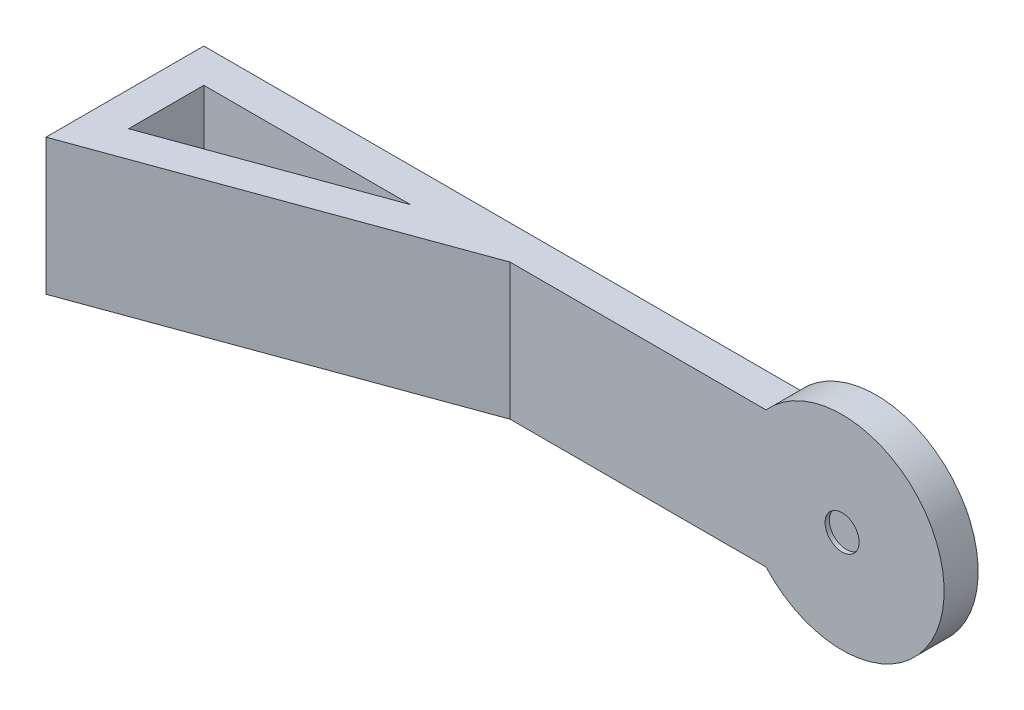
ISO-10303-21;
HEADER;
FILE_DESCRIPTION(('STEP AP214'),'2;1');
FILE_NAME('part.step','',(''),(''),'','','');
FILE_SCHEMA(('AUTOMOTIVE_DESIGN { 1 0 10303 214 1 1 1 1 }'));
ENDSEC;
DATA;
#1=APPLICATION_CONTEXT('core data for automotive mechanical design processes');
#2=APPLICATION_PROTOCOL_DEFINITION('international standard','automotive_design',2000,#1);
#3=PRODUCT_CONTEXT('',#1,'mechanical');
#4=PRODUCT('Part','Part','',(#3));
#5=PRODUCT_RELATED_PRODUCT_CATEGORY('part','',(#4));
#6=PRODUCT_DEFINITION_FORMATION('','',#4);
#7=PRODUCT_DEFINITION_CONTEXT('part definition',#1,'design');
#8=PRODUCT_DEFINITION('design','',#6,#7);
#9=PRODUCT_DEFINITION_SHAPE('','',#8);
#10=(LENGTH_UNIT() NAMED_UNIT(*) SI_UNIT(.MILLI.,.METRE.));
#11=(NAMED_UNIT(*) PLANE_ANGLE_UNIT() SI_UNIT($,.RADIAN.));
#12=(NAMED_UNIT(*) SI_UNIT($,.STERADIAN.) SOLID_ANGLE_UNIT());
#13=UNCERTAINTY_MEASURE_WITH_UNIT(LENGTH_MEASURE(1.E-05),#10,'distance_accuracy_value','');
#14=(GEOMETRIC_REPRESENTATION_CONTEXT(3) GLOBAL_UNCERTAINTY_ASSIGNED_CONTEXT((#13)) GLOBAL_UNIT_ASSIGNED_CONTEXT((#10,
#11,#12)) REPRESENTATION_CONTEXT('',''));
#15=CARTESIAN_POINT('',(0.,0.,0.));
#16=DIRECTION('',(0.,0.,1.));
#17=DIRECTION('',(1.,0.,0.));
#18=AXIS2_PLACEMENT_3D('',#15,#16,#17);
#19=CARTESIAN_POINT('',(125.500968342876,-12.6999999999999,-19.05));
#20=DIRECTION('',(0.,0.,1.));
#21=DIRECTION('',(-1.,0.,0.));
#22=AXIS2_PLACEMENT_3D('',#19,#20,#21);
#23=CYLINDRICAL_SURFACE('',#22,3.175);
#24=CARTESIAN_POINT('',(125.500968342876,-12.7,0.));
#25=DIRECTION('',(0.,0.,1.));
#26=DIRECTION('',(-1.,0.,0.));
#27=AXIS2_PLACEMENT_3D('',#24,#25,#26);
#28=CIRCLE('',#27,3.175);
#29=CARTESIAN_POINT('',(122.325968342876,-12.7,0.));
#30=VERTEX_POINT('',#29);
#31=EDGE_CURVE('E189',#30,#30,#28,.T.);
#32=ORIENTED_EDGE('',*,*,#31,.F.);
#33=EDGE_LOOP('',(#32));
#34=FACE_BOUND('',#33,.T.);
#35=CARTESIAN_POINT('',(125.500968342876,-12.7,0.793749999999955));
#36=DIRECTION('',(0.,0.,1.));
#37=DIRECTION('',(-1.,0.,0.));
#38=AXIS2_PLACEMENT_3D('',#35,#36,#37);
#39=CIRCLE('',#38,3.175);
#40=CARTESIAN_POINT('',(122.325968342876,-12.7,0.793749999999955));
#41=VERTEX_POINT('',#40);
#42=EDGE_CURVE('E12',#41,#41,#39,.F.);
#43=ORIENTED_EDGE('',*,*,#42,.F.);
#44=EDGE_LOOP('',(#43));
#45=FACE_BOUND('',#44,.T.);
#46=ADVANCED_FACE('F43',(#34,#45),#23,.F.);
#47=CARTESIAN_POINT('',(0.,-25.4,0.));
#48=DIRECTION('',(0.,1.,0.));
#49=DIRECTION('',(-1.,0.,0.));
#50=AXIS2_PLACEMENT_3D('',#47,#48,#49);
#51=PLANE('',#50);
#52=DIRECTION('',(1.,0.,0.));
#53=VECTOR('',#52,1.);
#54=CARTESIAN_POINT('',(139.7,-25.4,0.));
#55=LINE('',#54,#53);
#56=CARTESIAN_POINT('',(0.,-25.4,0.));
#57=VERTEX_POINT('',#56);
#58=CARTESIAN_POINT('',(111.301936685753,-25.4,0.));
#59=VERTEX_POINT('',#58);
#60=EDGE_CURVE('E58',#57,#59,#55,.T.);
#61=ORIENTED_EDGE('',*,*,#60,.T.);
#62=DIRECTION('',(0.,0.,1.));
#63=VECTOR('',#62,1.);
#64=CARTESIAN_POINT('',(111.301936685753,-25.3999999999998,-53.881536726415));
#65=LINE('',#64,#63);
#66=CARTESIAN_POINT('',(111.301936685753,-25.4,6.34999999999991));
#67=VERTEX_POINT('',#66);
#68=EDGE_CURVE('E139',#59,#67,#65,.T.);
#69=ORIENTED_EDGE('',*,*,#68,.T.);
#70=DIRECTION('',(-1.,0.,0.));
#71=VECTOR('',#70,1.);
#72=CARTESIAN_POINT('',(63.5,-25.4,6.34999999999991));
#73=LINE('',#72,#71);
#74=CARTESIAN_POINT('',(63.5,-25.4,6.34999999999991));
#75=VERTEX_POINT('',#74);
#76=EDGE_CURVE('E146',#67,#75,#73,.T.);
#77=ORIENTED_EDGE('',*,*,#76,.T.);
#78=DIRECTION('',(-0.939692620785908,0.,0.34202014332567));
#79=VECTOR('',#78,1.);
#80=CARTESIAN_POINT('',(0.,-25.4000000000001,29.4621098759038));
#81=LINE('',#80,#79);
#82=CARTESIAN_POINT('',(0.,-25.4000000000001,29.4621098759038));
#83=VERTEX_POINT('',#82);
#84=EDGE_CURVE('E149',#75,#83,#81,.T.);
#85=ORIENTED_EDGE('',*,*,#84,.T.);
#86=DIRECTION('',(0.,0.,-1.));
#87=VECTOR('',#86,1.);
#88=CARTESIAN_POINT('',(0.,-25.4,0.));
#89=LINE('',#88,#87);
#90=EDGE_CURVE('E151',#83,#57,#89,.T.);
#91=ORIENTED_EDGE('',*,*,#90,.T.);
#92=EDGE_LOOP('',(#61,#69,#77,#85,#91));
#93=FACE_BOUND('',#92,.T.);
#94=DIRECTION('',(-0.939692620785908,0.,0.34202014332567));
#95=VECTOR('',#94,1.);
#96=CARTESIAN_POINT('',(6.35,-25.4000000000001,20.3933700330914));
#97=LINE('',#96,#95);
#98=CARTESIAN_POINT('',(44.9338420589645,-25.4,6.34999999999991));
#99=VERTEX_POINT('',#98);
#100=CARTESIAN_POINT('',(6.35,-25.4000000000001,20.3933700330914));
#101=VERTEX_POINT('',#100);
#102=EDGE_CURVE('E110',#99,#101,#97,.T.);
#103=ORIENTED_EDGE('',*,*,#102,.F.);
#104=DIRECTION('',(1.,0.,0.));
#105=VECTOR('',#104,1.);
#106=CARTESIAN_POINT('',(44.9338420589645,-25.4,6.34999999999991));
#107=LINE('',#106,#105);
#108=CARTESIAN_POINT('',(6.35,-25.4,6.34999999999991));
#109=VERTEX_POINT('',#108);
#110=EDGE_CURVE('E132',#109,#99,#107,.T.);
#111=ORIENTED_EDGE('',*,*,#110,.F.);
#112=DIRECTION('',(0.,0.,-1.));
#113=VECTOR('',#112,1.);
#114=CARTESIAN_POINT('',(6.35,-25.4,6.34999999999991));
#115=LINE('',#114,#113);
#116=EDGE_CURVE('E120',#101,#109,#115,.T.);
#117=ORIENTED_EDGE('',*,*,#116,.F.);
#118=EDGE_LOOP('',(#103,#111,#117));
#119=FACE_BOUND('',#118,.T.);
#120=ADVANCED_FACE('F131',(#93,#119),#51,.F.);
#121=CARTESIAN_POINT('',(0.,0.,0.));
#122=DIRECTION('',(0.,1.,0.));
#123=DIRECTION('',(-1.,0.,0.));
#124=AXIS2_PLACEMENT_3D('',#121,#122,#123);
#125=PLANE('',#124);
#126=DIRECTION('',(0.,0.,1.));
#127=VECTOR('',#126,1.);
#128=CARTESIAN_POINT('',(111.301936685753,1.88126379988469E-13,-53.881536726415));
#129=LINE('',#128,#127);
#130=CARTESIAN_POINT('',(111.301936685753,0.,0.));
#131=VERTEX_POINT('',#130);
#132=CARTESIAN_POINT('',(111.301936685753,0.,6.35));
#133=VERTEX_POINT('',#132);
#134=EDGE_CURVE('E185',#131,#133,#129,.T.);
#135=ORIENTED_EDGE('',*,*,#134,.F.);
#136=DIRECTION('',(1.,0.,0.));
#137=VECTOR('',#136,1.);
#138=CARTESIAN_POINT('',(139.7,0.,0.));
#139=LINE('',#138,#137);
#140=CARTESIAN_POINT('',(0.,0.,0.));
#141=VERTEX_POINT('',#140);
#142=EDGE_CURVE('E128',#141,#131,#139,.T.);
#143=ORIENTED_EDGE('',*,*,#142,.F.);
#144=DIRECTION('',(0.,0.,-1.));
#145=VECTOR('',#144,1.);
#146=CARTESIAN_POINT('',(0.,0.,0.));
#147=LINE('',#146,#145);
#148=CARTESIAN_POINT('',(0.,-1.02866406834665E-13,29.4621098759039));
#149=VERTEX_POINT('',#148);
#150=EDGE_CURVE('E147',#149,#141,#147,.T.);
#151=ORIENTED_EDGE('',*,*,#150,.F.);
#152=DIRECTION('',(-0.939692620785908,0.,0.34202014332567));
#153=VECTOR('',#152,1.);
#154=CARTESIAN_POINT('',(0.,-1.02866406834665E-13,29.4621098759039));
#155=LINE('',#154,#153);
#156=CARTESIAN_POINT('',(63.5,0.,6.35));
#157=VERTEX_POINT('',#156);
#158=EDGE_CURVE('E158',#157,#149,#155,.T.);
#159=ORIENTED_EDGE('',*,*,#158,.F.);
#160=DIRECTION('',(-1.,0.,0.));
#161=VECTOR('',#160,1.);
#162=CARTESIAN_POINT('',(63.5,0.,6.35));
#163=LINE('',#162,#161);
#164=EDGE_CURVE('E156',#133,#157,#163,.T.);
#165=ORIENTED_EDGE('',*,*,#164,.F.);
#166=EDGE_LOOP('',(#135,#143,#151,#159,#165));
#167=FACE_BOUND('',#166,.T.);
#168=DIRECTION('',(1.,0.,0.));
#169=VECTOR('',#168,1.);
#170=CARTESIAN_POINT('',(44.9338420589645,0.,6.35));
#171=LINE('',#170,#169);
#172=CARTESIAN_POINT('',(6.35,0.,6.34999999999999));
#173=VERTEX_POINT('',#172);
#174=CARTESIAN_POINT('',(44.9338420589645,0.,6.35));
#175=VERTEX_POINT('',#174);
#176=EDGE_CURVE('E121',#173,#175,#171,.T.);
#177=ORIENTED_EDGE('',*,*,#176,.T.);
#178=DIRECTION('',(-0.939692620785908,0.,0.34202014332567));
#179=VECTOR('',#178,1.);
#180=CARTESIAN_POINT('',(6.35,0.,20.3933700330915));
#181=LINE('',#180,#179);
#182=CARTESIAN_POINT('',(6.35,0.,20.3933700330915));
#183=VERTEX_POINT('',#182);
#184=EDGE_CURVE('E137',#175,#183,#181,.T.);
#185=ORIENTED_EDGE('',*,*,#184,.T.);
#186=DIRECTION('',(0.,0.,-1.));
#187=VECTOR('',#186,1.);
#188=CARTESIAN_POINT('',(6.35,0.,6.34999999999999));
#189=LINE('',#188,#187);
#190=EDGE_CURVE('E127',#183,#173,#189,.T.);
#191=ORIENTED_EDGE('',*,*,#190,.T.);
#192=EDGE_LOOP('',(#177,#185,#191));
#193=FACE_BOUND('',#192,.T.);
#194=ADVANCED_FACE('F177',(#167,#193),#125,.T.);
#195=CARTESIAN_POINT('',(139.7,-25.4,0.));
#196=DIRECTION('',(0.,0.,1.));
#197=DIRECTION('',(-1.,0.,0.));
#198=AXIS2_PLACEMENT_3D('',#195,#196,#197);
#199=PLANE('',#198);
#200=ORIENTED_EDGE('',*,*,#31,.T.);
#201=EDGE_LOOP('',(#200));
#202=FACE_BOUND('',#201,.T.);
#203=ORIENTED_EDGE('',*,*,#142,.T.);
#204=CARTESIAN_POINT('',(125.500968342876,-12.7,0.));
#205=DIRECTION('',(0.,0.,1.));
#206=DIRECTION('',(-1.,0.,0.));
#207=AXIS2_PLACEMENT_3D('',#204,#205,#206);
#208=CIRCLE('',#207,19.05);
#209=EDGE_CURVE('E65',#131,#59,#208,.F.);
#210=ORIENTED_EDGE('',*,*,#209,.T.);
#211=ORIENTED_EDGE('',*,*,#60,.F.);
#212=DIRECTION('',(0.,1.,0.));
#213=VECTOR('',#212,1.);
#214=CARTESIAN_POINT('',(0.,-25.4,0.));
#215=LINE('',#214,#213);
#216=EDGE_CURVE('E153',#57,#141,#215,.T.);
#217=ORIENTED_EDGE('',*,*,#216,.T.);
#218=EDGE_LOOP('',(#203,#210,#211,#217));
#219=FACE_BOUND('',#218,.T.);
#220=ADVANCED_FACE('F45',(#202,#219),#199,.F.);
#221=CARTESIAN_POINT('',(63.5,-25.4,6.34999999999991));
#222=DIRECTION('',(0.,0.,-1.));
#223=DIRECTION('',(1.,0.,0.));
#224=AXIS2_PLACEMENT_3D('',#221,#222,#223);
#225=PLANE('',#224);
#226=CARTESIAN_POINT('',(125.500968342876,-12.7,6.34999999999996));
#227=DIRECTION('',(0.,0.,1.));
#228=DIRECTION('',(-1.,0.,0.));
#229=AXIS2_PLACEMENT_3D('',#226,#227,#228);
#230=CIRCLE('',#229,3.175);
#231=CARTESIAN_POINT('',(122.325968342876,-12.7,6.34999999999996));
#232=VERTEX_POINT('',#231);
#233=EDGE_CURVE('E327',#232,#232,#230,.T.);
#234=ORIENTED_EDGE('',*,*,#233,.F.);
#235=EDGE_LOOP('',(#234));
#236=FACE_BOUND('',#235,.T.);
#237=ORIENTED_EDGE('',*,*,#76,.F.);
#238=CARTESIAN_POINT('',(125.500968342876,-12.7,6.34999999999996));
#239=DIRECTION('',(0.,0.,1.));
#240=DIRECTION('',(-1.,0.,0.));
#241=AXIS2_PLACEMENT_3D('',#238,#239,#240);
#242=CIRCLE('',#241,19.05);
#243=EDGE_CURVE('E186',#67,#133,#242,.T.);
#244=ORIENTED_EDGE('',*,*,#243,.T.);
#245=ORIENTED_EDGE('',*,*,#164,.T.);
#246=DIRECTION('',(0.,1.,0.));
#247=VECTOR('',#246,1.);
#248=CARTESIAN_POINT('',(63.5,-25.4,6.34999999999991));
#249=LINE('',#248,#247);
#250=EDGE_CURVE('E51',#75,#157,#249,.T.);
#251=ORIENTED_EDGE('',*,*,#250,.F.);
#252=EDGE_LOOP('',(#237,#244,#245,#251));
#253=FACE_BOUND('',#252,.T.);
#254=ADVANCED_FACE('F194',(#236,#253),#225,.F.);
#255=CARTESIAN_POINT('',(0.,-25.4000000000001,29.4621098759038));
#256=DIRECTION('',(-0.34202014332567,0.,-0.939692620785908));
#257=DIRECTION('',(0.939692620785908,0.,-0.34202014332567));
#258=AXIS2_PLACEMENT_3D('',#255,#256,#257);
#259=PLANE('',#258);
#260=ORIENTED_EDGE('',*,*,#158,.T.);
#261=DIRECTION('',(0.,1.,0.));
#262=VECTOR('',#261,1.);
#263=CARTESIAN_POINT('',(0.,-25.4000000000001,29.4621098759038));
#264=LINE('',#263,#262);
#265=EDGE_CURVE('E163',#83,#149,#264,.T.);
#266=ORIENTED_EDGE('',*,*,#265,.F.);
#267=ORIENTED_EDGE('',*,*,#84,.F.);
#268=ORIENTED_EDGE('',*,*,#250,.T.);
#269=EDGE_LOOP('',(#260,#266,#267,#268));
#270=FACE_BOUND('',#269,.T.);
#271=ADVANCED_FACE('F170',(#270),#259,.F.);
#272=CARTESIAN_POINT('',(0.,-25.4,0.));
#273=DIRECTION('',(1.,0.,0.));
#274=DIRECTION('',(0.,0.,1.));
#275=AXIS2_PLACEMENT_3D('',#272,#273,#274);
#276=PLANE('',#275);
#277=ORIENTED_EDGE('',*,*,#150,.T.);
#278=ORIENTED_EDGE('',*,*,#216,.F.);
#279=ORIENTED_EDGE('',*,*,#90,.F.);
#280=ORIENTED_EDGE('',*,*,#265,.T.);
#281=EDGE_LOOP('',(#277,#278,#279,#280));
#282=FACE_BOUND('',#281,.T.);
#283=ADVANCED_FACE('F182',(#282),#276,.F.);
#284=CARTESIAN_POINT('',(6.35,-25.4000000000001,20.3933700330914));
#285=DIRECTION('',(-0.34202014332567,0.,-0.939692620785908));
#286=DIRECTION('',(0.939692620785908,0.,-0.34202014332567));
#287=AXIS2_PLACEMENT_3D('',#284,#285,#286);
#288=PLANE('',#287);
#289=ORIENTED_EDGE('',*,*,#184,.F.);
#290=DIRECTION('',(0.,1.,0.));
#291=VECTOR('',#290,1.);
#292=CARTESIAN_POINT('',(44.9338420589645,-25.4,6.34999999999991));
#293=LINE('',#292,#291);
#294=EDGE_CURVE('E116',#99,#175,#293,.T.);
#295=ORIENTED_EDGE('',*,*,#294,.F.);
#296=ORIENTED_EDGE('',*,*,#102,.T.);
#297=DIRECTION('',(0.,1.,0.));
#298=VECTOR('',#297,1.);
#299=CARTESIAN_POINT('',(6.35,-25.4000000000001,20.3933700330914));
#300=LINE('',#299,#298);
#301=EDGE_CURVE('E113',#101,#183,#300,.T.);
#302=ORIENTED_EDGE('',*,*,#301,.T.);
#303=EDGE_LOOP('',(#289,#295,#296,#302));
#304=FACE_BOUND('',#303,.T.);
#305=ADVANCED_FACE('F112',(#304),#288,.T.);
#306=CARTESIAN_POINT('',(6.35,-25.4,6.34999999999991));
#307=DIRECTION('',(1.,0.,0.));
#308=DIRECTION('',(0.,0.,1.));
#309=AXIS2_PLACEMENT_3D('',#306,#307,#308);
#310=PLANE('',#309);
#311=ORIENTED_EDGE('',*,*,#190,.F.);
#312=ORIENTED_EDGE('',*,*,#301,.F.);
#313=ORIENTED_EDGE('',*,*,#116,.T.);
#314=DIRECTION('',(0.,1.,0.));
#315=VECTOR('',#314,1.);
#316=CARTESIAN_POINT('',(6.35,-25.4,6.34999999999991));
#317=LINE('',#316,#315);
#318=EDGE_CURVE('E129',#109,#173,#317,.T.);
#319=ORIENTED_EDGE('',*,*,#318,.T.);
#320=EDGE_LOOP('',(#311,#312,#313,#319));
#321=FACE_BOUND('',#320,.T.);
#322=ADVANCED_FACE('F125',(#321),#310,.T.);
#323=CARTESIAN_POINT('',(44.9338420589645,-25.4,6.34999999999991));
#324=DIRECTION('',(0.,0.,1.));
#325=DIRECTION('',(-1.,0.,0.));
#326=AXIS2_PLACEMENT_3D('',#323,#324,#325);
#327=PLANE('',#326);
#328=ORIENTED_EDGE('',*,*,#176,.F.);
#329=ORIENTED_EDGE('',*,*,#318,.F.);
#330=ORIENTED_EDGE('',*,*,#110,.T.);
#331=ORIENTED_EDGE('',*,*,#294,.T.);
#332=EDGE_LOOP('',(#328,#329,#330,#331));
#333=FACE_BOUND('',#332,.T.);
#334=ADVANCED_FACE('F198',(#333),#327,.T.);
#335=CARTESIAN_POINT('',(125.500968342876,-12.6999999999998,-53.881536726415));
#336=DIRECTION('',(0.,0.,1.));
#337=DIRECTION('',(-1.,0.,0.));
#338=AXIS2_PLACEMENT_3D('',#335,#336,#337);
#339=CYLINDRICAL_SURFACE('',#338,19.05);
#340=ORIENTED_EDGE('',*,*,#68,.F.);
#341=ORIENTED_EDGE('',*,*,#209,.F.);
#342=ORIENTED_EDGE('',*,*,#134,.T.);
#343=ORIENTED_EDGE('',*,*,#243,.F.);
#344=EDGE_LOOP('',(#340,#341,#342,#343));
#345=FACE_BOUND('',#344,.T.);
#346=ADVANCED_FACE('F195',(#345),#339,.T.);
#347=CARTESIAN_POINT('',(125.500968342876,-12.7,5.55624999999996));
#348=DIRECTION('',(0.,0.,1.));
#349=DIRECTION('',(-1.,0.,0.));
#350=AXIS2_PLACEMENT_3D('',#347,#348,#349);
#351=CIRCLE('',#350,3.175);
#352=CARTESIAN_POINT('',(122.325968342876,-12.7,5.55624999999996));
#353=VERTEX_POINT('',#352);
#354=EDGE_CURVE('E329',#353,#353,#351,.T.);
#355=ORIENTED_EDGE('',*,*,#354,.F.);
#356=EDGE_LOOP('',(#355));
#357=FACE_BOUND('',#356,.T.);
#358=ORIENTED_EDGE('',*,*,#233,.T.);
#359=EDGE_LOOP('',(#358));
#360=FACE_BOUND('',#359,.T.);
#361=ADVANCED_FACE('F197',(#357,#360),#23,.F.);
#362=CARTESIAN_POINT('',(139.7,-25.4,0.793749999999912));
#363=DIRECTION('',(0.,0.,1.));
#364=DIRECTION('',(-1.,0.,0.));
#365=AXIS2_PLACEMENT_3D('',#362,#363,#364);
#366=PLANE('',#365);
#367=ORIENTED_EDGE('',*,*,#42,.T.);
#368=EDGE_LOOP('',(#367));
#369=FACE_BOUND('',#368,.T.);
#370=ADVANCED_FACE('F204',(#369),#366,.F.);
#371=CARTESIAN_POINT('',(0.,0.,5.55625));
#372=DIRECTION('',(0.,0.,1.));
#373=DIRECTION('',(-1.,0.,0.));
#374=AXIS2_PLACEMENT_3D('',#371,#372,#373);
#375=PLANE('',#374);
#376=ORIENTED_EDGE('',*,*,#354,.T.);
#377=EDGE_LOOP('',(#376));
#378=FACE_BOUND('',#377,.T.);
#379=ADVANCED_FACE('F218',(#378),#375,.T.);
#380=CLOSED_SHELL('',(#46,#120,#194,#220,#254,#271,#283,#305,#322,#334,#346,#361,#370,#379));
#381=MANIFOLD_SOLID_BREP('B2',#380);
#382=ADVANCED_BREP_SHAPE_REPRESENTATION('',(#18,#381),#14);
#383=SHAPE_DEFINITION_REPRESENTATION(#9,#382);
ENDSEC;
END-ISO-10303-21;
